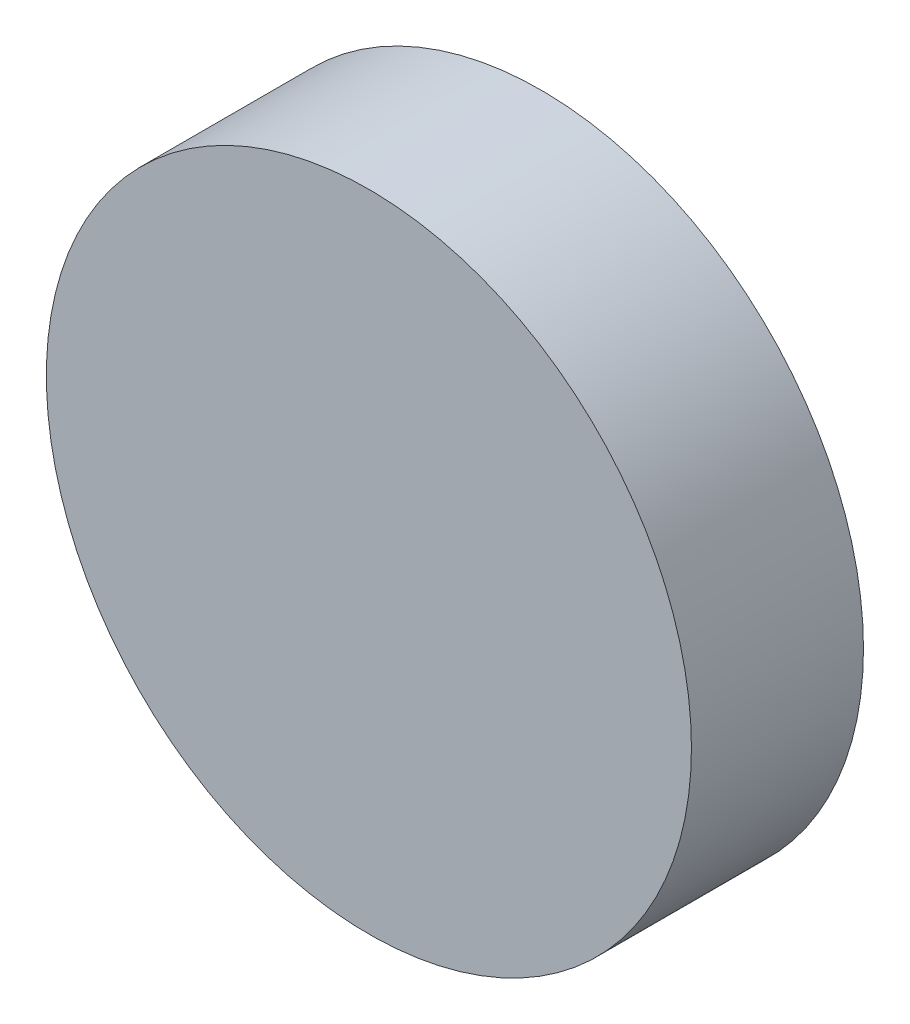
ISO-10303-21;
HEADER;
FILE_DESCRIPTION(('STEP AP214'),'2;1');
FILE_NAME('part.step','',(''),(''),'','','');
FILE_SCHEMA(('AUTOMOTIVE_DESIGN { 1 0 10303 214 1 1 1 1 }'));
ENDSEC;
DATA;
#1=APPLICATION_CONTEXT('core data for automotive mechanical design processes');
#2=APPLICATION_PROTOCOL_DEFINITION('international standard','automotive_design',2000,#1);
#3=PRODUCT_CONTEXT('',#1,'mechanical');
#4=PRODUCT('Part','Part','',(#3));
#5=PRODUCT_RELATED_PRODUCT_CATEGORY('part','',(#4));
#6=PRODUCT_DEFINITION_FORMATION('','',#4);
#7=PRODUCT_DEFINITION_CONTEXT('part definition',#1,'design');
#8=PRODUCT_DEFINITION('design','',#6,#7);
#9=PRODUCT_DEFINITION_SHAPE('','',#8);
#10=(LENGTH_UNIT() NAMED_UNIT(*) SI_UNIT(.MILLI.,.METRE.));
#11=(NAMED_UNIT(*) PLANE_ANGLE_UNIT() SI_UNIT($,.RADIAN.));
#12=(NAMED_UNIT(*) SI_UNIT($,.STERADIAN.) SOLID_ANGLE_UNIT());
#13=UNCERTAINTY_MEASURE_WITH_UNIT(LENGTH_MEASURE(1.E-05),#10,'distance_accuracy_value','');
#14=(GEOMETRIC_REPRESENTATION_CONTEXT(3) GLOBAL_UNCERTAINTY_ASSIGNED_CONTEXT((#13)) GLOBAL_UNIT_ASSIGNED_CONTEXT((#10,
#11,#12)) REPRESENTATION_CONTEXT('',''));
#15=CARTESIAN_POINT('',(0.,0.,0.));
#16=DIRECTION('',(0.,0.,1.));
#17=DIRECTION('',(1.,0.,0.));
#18=AXIS2_PLACEMENT_3D('',#15,#16,#17);
#19=CARTESIAN_POINT('',(0.,0.,20.));
#20=DIRECTION('',(0.,0.,-1.));
#21=DIRECTION('',(-1.,0.,0.));
#22=AXIS2_PLACEMENT_3D('',#19,#20,#21);
#23=CYLINDRICAL_SURFACE('',#22,37.5);
#24=CARTESIAN_POINT('',(0.,0.,20.));
#25=DIRECTION('',(0.,0.,1.));
#26=DIRECTION('',(1.,0.,0.));
#27=AXIS2_PLACEMENT_3D('',#24,#25,#26);
#28=CIRCLE('',#27,37.5);
#29=CARTESIAN_POINT('',(37.5,0.,20.));
#30=VERTEX_POINT('',#29);
#31=EDGE_CURVE('E10',#30,#30,#28,.T.);
#32=ORIENTED_EDGE('',*,*,#31,.F.);
#33=EDGE_LOOP('',(#32));
#34=FACE_BOUND('',#33,.T.);
#35=CARTESIAN_POINT('',(0.,0.,0.));
#36=DIRECTION('',(0.,0.,1.));
#37=DIRECTION('',(1.,0.,0.));
#38=AXIS2_PLACEMENT_3D('',#35,#36,#37);
#39=CIRCLE('',#38,37.5);
#40=CARTESIAN_POINT('',(37.5,0.,0.));
#41=VERTEX_POINT('',#40);
#42=EDGE_CURVE('E38',#41,#41,#39,.T.);
#43=ORIENTED_EDGE('',*,*,#42,.T.);
#44=EDGE_LOOP('',(#43));
#45=FACE_BOUND('',#44,.T.);
#46=ADVANCED_FACE('F35',(#34,#45),#23,.T.);
#47=CARTESIAN_POINT('',(0.,0.,20.));
#48=DIRECTION('',(0.,0.,1.));
#49=DIRECTION('',(1.,0.,0.));
#50=AXIS2_PLACEMENT_3D('',#47,#48,#49);
#51=PLANE('',#50);
#52=ORIENTED_EDGE('',*,*,#31,.T.);
#53=EDGE_LOOP('',(#52));
#54=FACE_BOUND('',#53,.T.);
#55=ADVANCED_FACE('F50',(#54),#51,.T.);
#56=CARTESIAN_POINT('',(0.,0.,0.));
#57=DIRECTION('',(0.,0.,1.));
#58=DIRECTION('',(1.,0.,0.));
#59=AXIS2_PLACEMENT_3D('',#56,#57,#58);
#60=PLANE('',#59);
#61=ORIENTED_EDGE('',*,*,#42,.F.);
#62=EDGE_LOOP('',(#61));
#63=FACE_BOUND('',#62,.T.);
#64=ADVANCED_FACE('F48',(#63),#60,.F.);
#65=CLOSED_SHELL('',(#46,#55,#64));
#66=MANIFOLD_SOLID_BREP('B2',#65);
#67=ADVANCED_BREP_SHAPE_REPRESENTATION('',(#18,#66),#14);
#68=SHAPE_DEFINITION_REPRESENTATION(#9,#67);
ENDSEC;
END-ISO-10303-21;
